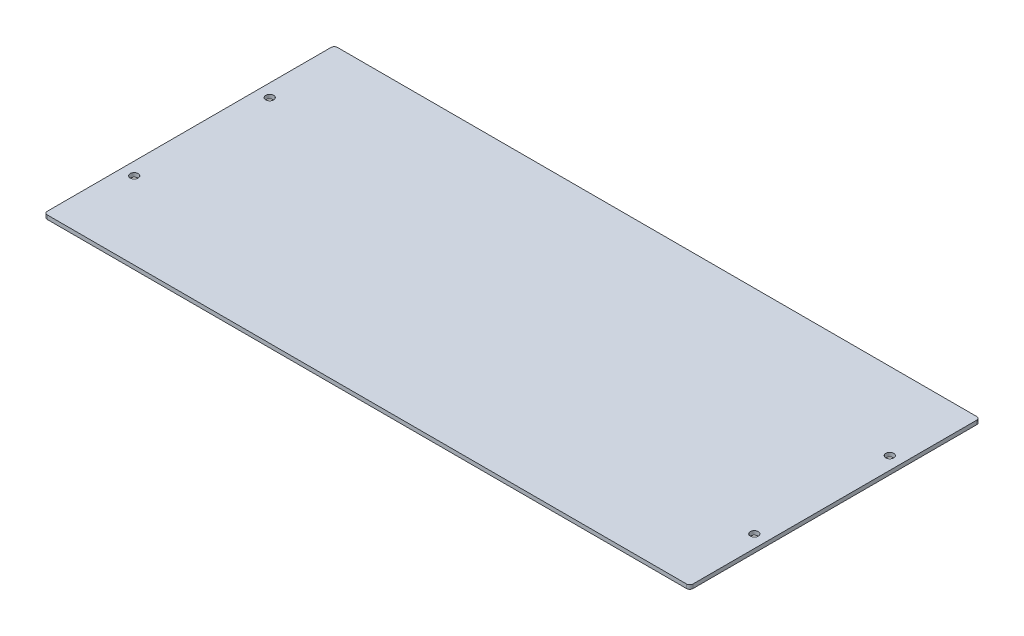
ISO-10303-21;
HEADER;
FILE_DESCRIPTION(('STEP AP214'),'2;1');
FILE_NAME('part.step','',(''),(''),'','','');
FILE_SCHEMA(('AUTOMOTIVE_DESIGN { 1 0 10303 214 1 1 1 1 }'));
ENDSEC;
DATA;
#1=APPLICATION_CONTEXT('core data for automotive mechanical design processes');
#2=APPLICATION_PROTOCOL_DEFINITION('international standard','automotive_design',2000,#1);
#3=PRODUCT_CONTEXT('',#1,'mechanical');
#4=PRODUCT('Part','Part','',(#3));
#5=PRODUCT_RELATED_PRODUCT_CATEGORY('part','',(#4));
#6=PRODUCT_DEFINITION_FORMATION('','',#4);
#7=PRODUCT_DEFINITION_CONTEXT('part definition',#1,'design');
#8=PRODUCT_DEFINITION('design','',#6,#7);
#9=PRODUCT_DEFINITION_SHAPE('','',#8);
#10=(LENGTH_UNIT() NAMED_UNIT(*) SI_UNIT(.MILLI.,.METRE.));
#11=(NAMED_UNIT(*) PLANE_ANGLE_UNIT() SI_UNIT($,.RADIAN.));
#12=(NAMED_UNIT(*) SI_UNIT($,.STERADIAN.) SOLID_ANGLE_UNIT());
#13=UNCERTAINTY_MEASURE_WITH_UNIT(LENGTH_MEASURE(1.E-05),#10,'distance_accuracy_value','');
#14=(GEOMETRIC_REPRESENTATION_CONTEXT(3) GLOBAL_UNCERTAINTY_ASSIGNED_CONTEXT((#13)) GLOBAL_UNIT_ASSIGNED_CONTEXT((#10,
#11,#12)) REPRESENTATION_CONTEXT('',''));
#15=CARTESIAN_POINT('',(0.,0.,0.));
#16=DIRECTION('',(0.,0.,1.));
#17=DIRECTION('',(1.,0.,0.));
#18=AXIS2_PLACEMENT_3D('',#15,#16,#17);
#19=CARTESIAN_POINT('',(257.175,3.175,115.57));
#20=DIRECTION('',(-1.,0.,0.));
#21=DIRECTION('',(0.,0.,1.));
#22=AXIS2_PLACEMENT_3D('',#19,#20,#21);
#23=PLANE('',#22);
#24=DIRECTION('',(0.,0.,-1.));
#25=VECTOR('',#24,1.);
#26=CARTESIAN_POINT('',(257.175,3.175,115.57));
#27=LINE('',#26,#25);
#28=CARTESIAN_POINT('',(257.175,3.175,113.03));
#29=VERTEX_POINT('',#28);
#30=CARTESIAN_POINT('',(257.175,3.175,-113.03));
#31=VERTEX_POINT('',#30);
#32=EDGE_CURVE('E120',#29,#31,#27,.T.);
#33=ORIENTED_EDGE('',*,*,#32,.F.);
#34=DIRECTION('',(0.,-1.,0.));
#35=VECTOR('',#34,1.);
#36=CARTESIAN_POINT('',(257.175,3.175,113.03));
#37=LINE('',#36,#35);
#38=CARTESIAN_POINT('',(257.175,0.,113.03));
#39=VERTEX_POINT('',#38);
#40=EDGE_CURVE('E105',#29,#39,#37,.T.);
#41=ORIENTED_EDGE('',*,*,#40,.T.);
#42=DIRECTION('',(0.,0.,-1.));
#43=VECTOR('',#42,1.);
#44=CARTESIAN_POINT('',(257.175,0.,115.57));
#45=LINE('',#44,#43);
#46=CARTESIAN_POINT('',(257.175,0.,-113.03));
#47=VERTEX_POINT('',#46);
#48=EDGE_CURVE('E117',#39,#47,#45,.T.);
#49=ORIENTED_EDGE('',*,*,#48,.T.);
#50=DIRECTION('',(0.,-1.,0.));
#51=VECTOR('',#50,1.);
#52=CARTESIAN_POINT('',(257.175,3.175,-113.03));
#53=LINE('',#52,#51);
#54=EDGE_CURVE('E122',#47,#31,#53,.F.);
#55=ORIENTED_EDGE('',*,*,#54,.T.);
#56=EDGE_LOOP('',(#33,#41,#49,#55));
#57=FACE_BOUND('',#56,.T.);
#58=ADVANCED_FACE('F35',(#57),#23,.F.);
#59=CARTESIAN_POINT('',(-257.175,3.175,-115.57));
#60=DIRECTION('',(0.,0.,1.));
#61=DIRECTION('',(1.,0.,0.));
#62=AXIS2_PLACEMENT_3D('',#59,#60,#61);
#63=PLANE('',#62);
#64=DIRECTION('',(-1.,0.,0.));
#65=VECTOR('',#64,1.);
#66=CARTESIAN_POINT('',(-257.175,0.,-115.57));
#67=LINE('',#66,#65);
#68=CARTESIAN_POINT('',(254.635,0.,-115.57));
#69=VERTEX_POINT('',#68);
#70=CARTESIAN_POINT('',(-254.635,0.,-115.57));
#71=VERTEX_POINT('',#70);
#72=EDGE_CURVE('E127',#69,#71,#67,.T.);
#73=ORIENTED_EDGE('',*,*,#72,.T.);
#74=DIRECTION('',(0.,-1.,0.));
#75=VECTOR('',#74,1.);
#76=CARTESIAN_POINT('',(-254.635,3.175,-115.57));
#77=LINE('',#76,#75);
#78=CARTESIAN_POINT('',(-254.635,3.175,-115.57));
#79=VERTEX_POINT('',#78);
#80=EDGE_CURVE('E11',#71,#79,#77,.F.);
#81=ORIENTED_EDGE('',*,*,#80,.T.);
#82=DIRECTION('',(-1.,0.,0.));
#83=VECTOR('',#82,1.);
#84=CARTESIAN_POINT('',(-257.175,3.175,-115.57));
#85=LINE('',#84,#83);
#86=CARTESIAN_POINT('',(254.635,3.175,-115.57));
#87=VERTEX_POINT('',#86);
#88=EDGE_CURVE('E166',#87,#79,#85,.T.);
#89=ORIENTED_EDGE('',*,*,#88,.F.);
#90=DIRECTION('',(0.,-1.,0.));
#91=VECTOR('',#90,1.);
#92=CARTESIAN_POINT('',(254.635,3.175,-115.57));
#93=LINE('',#92,#91);
#94=EDGE_CURVE('E43',#87,#69,#93,.T.);
#95=ORIENTED_EDGE('',*,*,#94,.T.);
#96=EDGE_LOOP('',(#73,#81,#89,#95));
#97=FACE_BOUND('',#96,.T.);
#98=ADVANCED_FACE('F164',(#97),#63,.F.);
#99=CARTESIAN_POINT('',(-257.175,3.175,115.57));
#100=DIRECTION('',(1.,0.,0.));
#101=DIRECTION('',(0.,0.,-1.));
#102=AXIS2_PLACEMENT_3D('',#99,#100,#101);
#103=PLANE('',#102);
#104=DIRECTION('',(0.,0.,1.));
#105=VECTOR('',#104,1.);
#106=CARTESIAN_POINT('',(-257.175,3.175,115.57));
#107=LINE('',#106,#105);
#108=CARTESIAN_POINT('',(-257.175,3.175,-113.03));
#109=VERTEX_POINT('',#108);
#110=CARTESIAN_POINT('',(-257.175,3.175,113.03));
#111=VERTEX_POINT('',#110);
#112=EDGE_CURVE('E174',#109,#111,#107,.T.);
#113=ORIENTED_EDGE('',*,*,#112,.F.);
#114=DIRECTION('',(0.,-1.,0.));
#115=VECTOR('',#114,1.);
#116=CARTESIAN_POINT('',(-257.175,3.175,-113.03));
#117=LINE('',#116,#115);
#118=CARTESIAN_POINT('',(-257.175,0.,-113.03));
#119=VERTEX_POINT('',#118);
#120=EDGE_CURVE('E158',#109,#119,#117,.T.);
#121=ORIENTED_EDGE('',*,*,#120,.T.);
#122=DIRECTION('',(0.,0.,1.));
#123=VECTOR('',#122,1.);
#124=CARTESIAN_POINT('',(-257.175,0.,115.57));
#125=LINE('',#124,#123);
#126=CARTESIAN_POINT('',(-257.175,0.,113.03));
#127=VERTEX_POINT('',#126);
#128=EDGE_CURVE('E131',#119,#127,#125,.T.);
#129=ORIENTED_EDGE('',*,*,#128,.T.);
#130=DIRECTION('',(0.,-1.,0.));
#131=VECTOR('',#130,1.);
#132=CARTESIAN_POINT('',(-257.175,3.175,113.03));
#133=LINE('',#132,#131);
#134=EDGE_CURVE('E50',#127,#111,#133,.F.);
#135=ORIENTED_EDGE('',*,*,#134,.T.);
#136=EDGE_LOOP('',(#113,#121,#129,#135));
#137=FACE_BOUND('',#136,.T.);
#138=ADVANCED_FACE('F173',(#137),#103,.F.);
#139=CARTESIAN_POINT('',(-257.175,3.175,115.57));
#140=DIRECTION('',(0.,0.,-1.));
#141=DIRECTION('',(-1.,0.,0.));
#142=AXIS2_PLACEMENT_3D('',#139,#140,#141);
#143=PLANE('',#142);
#144=DIRECTION('',(1.,0.,0.));
#145=VECTOR('',#144,1.);
#146=CARTESIAN_POINT('',(-257.175,0.,115.57));
#147=LINE('',#146,#145);
#148=CARTESIAN_POINT('',(-254.635,0.,115.57));
#149=VERTEX_POINT('',#148);
#150=CARTESIAN_POINT('',(254.635,0.,115.57));
#151=VERTEX_POINT('',#150);
#152=EDGE_CURVE('E141',#149,#151,#147,.T.);
#153=ORIENTED_EDGE('',*,*,#152,.T.);
#154=DIRECTION('',(0.,-1.,0.));
#155=VECTOR('',#154,1.);
#156=CARTESIAN_POINT('',(254.635,3.175,115.57));
#157=LINE('',#156,#155);
#158=CARTESIAN_POINT('',(254.635,3.175,115.57));
#159=VERTEX_POINT('',#158);
#160=EDGE_CURVE('E106',#151,#159,#157,.F.);
#161=ORIENTED_EDGE('',*,*,#160,.T.);
#162=DIRECTION('',(1.,0.,0.));
#163=VECTOR('',#162,1.);
#164=CARTESIAN_POINT('',(-257.175,3.175,115.57));
#165=LINE('',#164,#163);
#166=CARTESIAN_POINT('',(-254.635,3.175,115.57));
#167=VERTEX_POINT('',#166);
#168=EDGE_CURVE('E137',#167,#159,#165,.T.);
#169=ORIENTED_EDGE('',*,*,#168,.F.);
#170=DIRECTION('',(0.,-1.,0.));
#171=VECTOR('',#170,1.);
#172=CARTESIAN_POINT('',(-254.635,3.175,115.57));
#173=LINE('',#172,#171);
#174=EDGE_CURVE('E111',#167,#149,#173,.T.);
#175=ORIENTED_EDGE('',*,*,#174,.T.);
#176=EDGE_LOOP('',(#153,#161,#169,#175));
#177=FACE_BOUND('',#176,.T.);
#178=ADVANCED_FACE('F206',(#177),#143,.F.);
#179=CARTESIAN_POINT('',(0.,3.175,0.));
#180=DIRECTION('',(0.,-1.,0.));
#181=DIRECTION('',(0.,0.,-1.));
#182=AXIS2_PLACEMENT_3D('',#179,#180,#181);
#183=PLANE('',#182);
#184=CARTESIAN_POINT('',(-247.015,3.175,-53.975));
#185=DIRECTION('',(0.,1.,0.));
#186=DIRECTION('',(0.,0.,1.));
#187=AXIS2_PLACEMENT_3D('',#184,#185,#186);
#188=CIRCLE('',#187,3.17499999999998);
#189=CARTESIAN_POINT('',(-247.015,3.175,-50.8));
#190=VERTEX_POINT('',#189);
#191=EDGE_CURVE('E197',#190,#190,#188,.T.);
#192=ORIENTED_EDGE('',*,*,#191,.F.);
#193=EDGE_LOOP('',(#192));
#194=FACE_BOUND('',#193,.T.);
#195=CARTESIAN_POINT('',(-247.015,3.175,53.975));
#196=DIRECTION('',(0.,1.,0.));
#197=DIRECTION('',(0.,0.,1.));
#198=AXIS2_PLACEMENT_3D('',#195,#196,#197);
#199=CIRCLE('',#198,3.17499999999998);
#200=CARTESIAN_POINT('',(-247.015,3.175,57.15));
#201=VERTEX_POINT('',#200);
#202=EDGE_CURVE('E191',#201,#201,#199,.T.);
#203=ORIENTED_EDGE('',*,*,#202,.F.);
#204=EDGE_LOOP('',(#203));
#205=FACE_BOUND('',#204,.T.);
#206=CARTESIAN_POINT('',(247.015,3.175,53.9749999999999));
#207=DIRECTION('',(0.,1.,0.));
#208=DIRECTION('',(0.,0.,1.));
#209=AXIS2_PLACEMENT_3D('',#206,#207,#208);
#210=CIRCLE('',#209,3.17499999999998);
#211=CARTESIAN_POINT('',(247.015,3.175,57.1499999999999));
#212=VERTEX_POINT('',#211);
#213=EDGE_CURVE('E185',#212,#212,#210,.T.);
#214=ORIENTED_EDGE('',*,*,#213,.F.);
#215=EDGE_LOOP('',(#214));
#216=FACE_BOUND('',#215,.T.);
#217=CARTESIAN_POINT('',(247.015,3.175,-53.9750000000001));
#218=DIRECTION('',(0.,1.,0.));
#219=DIRECTION('',(0.,0.,1.));
#220=AXIS2_PLACEMENT_3D('',#217,#218,#219);
#221=CIRCLE('',#220,3.17499999999998);
#222=CARTESIAN_POINT('',(247.015,3.175,-50.8000000000001));
#223=VERTEX_POINT('',#222);
#224=EDGE_CURVE('E134',#223,#223,#221,.T.);
#225=ORIENTED_EDGE('',*,*,#224,.F.);
#226=EDGE_LOOP('',(#225));
#227=FACE_BOUND('',#226,.T.);
#228=ORIENTED_EDGE('',*,*,#168,.T.);
#229=CARTESIAN_POINT('',(254.635,3.175,113.03));
#230=DIRECTION('',(0.,-1.,0.));
#231=DIRECTION('',(0.,0.,-1.));
#232=AXIS2_PLACEMENT_3D('',#229,#230,#231);
#233=CIRCLE('',#232,2.54);
#234=EDGE_CURVE('E155',#159,#29,#233,.F.);
#235=ORIENTED_EDGE('',*,*,#234,.T.);
#236=ORIENTED_EDGE('',*,*,#32,.T.);
#237=CARTESIAN_POINT('',(254.635,3.175,-113.03));
#238=DIRECTION('',(0.,-1.,0.));
#239=DIRECTION('',(0.,0.,-1.));
#240=AXIS2_PLACEMENT_3D('',#237,#238,#239);
#241=CIRCLE('',#240,2.54);
#242=EDGE_CURVE('E152',#31,#87,#241,.F.);
#243=ORIENTED_EDGE('',*,*,#242,.T.);
#244=ORIENTED_EDGE('',*,*,#88,.T.);
#245=CARTESIAN_POINT('',(-254.635,3.175,-113.03));
#246=DIRECTION('',(0.,-1.,0.));
#247=DIRECTION('',(0.,0.,-1.));
#248=AXIS2_PLACEMENT_3D('',#245,#246,#247);
#249=CIRCLE('',#248,2.54);
#250=EDGE_CURVE('E57',#79,#109,#249,.F.);
#251=ORIENTED_EDGE('',*,*,#250,.T.);
#252=ORIENTED_EDGE('',*,*,#112,.T.);
#253=CARTESIAN_POINT('',(-254.635,3.175,113.03));
#254=DIRECTION('',(0.,-1.,0.));
#255=DIRECTION('',(0.,0.,-1.));
#256=AXIS2_PLACEMENT_3D('',#253,#254,#255);
#257=CIRCLE('',#256,2.54);
#258=EDGE_CURVE('E150',#111,#167,#257,.F.);
#259=ORIENTED_EDGE('',*,*,#258,.T.);
#260=EDGE_LOOP('',(#228,#235,#236,#243,#244,#251,#252,#259));
#261=FACE_BOUND('',#260,.T.);
#262=ADVANCED_FACE('F203',(#194,#205,#216,#227,#261),#183,.F.);
#263=CARTESIAN_POINT('',(0.,0.,0.));
#264=DIRECTION('',(0.,-1.,0.));
#265=DIRECTION('',(0.,0.,-1.));
#266=AXIS2_PLACEMENT_3D('',#263,#264,#265);
#267=PLANE('',#266);
#268=CARTESIAN_POINT('',(-247.015,0.,-53.975));
#269=DIRECTION('',(0.,1.,0.));
#270=DIRECTION('',(0.,0.,1.));
#271=AXIS2_PLACEMENT_3D('',#268,#269,#270);
#272=CIRCLE('',#271,3.17500000000001);
#273=CARTESIAN_POINT('',(-247.015,0.,-50.8));
#274=VERTEX_POINT('',#273);
#275=EDGE_CURVE('E194',#274,#274,#272,.T.);
#276=ORIENTED_EDGE('',*,*,#275,.T.);
#277=EDGE_LOOP('',(#276));
#278=FACE_BOUND('',#277,.T.);
#279=CARTESIAN_POINT('',(-247.015,0.,53.975));
#280=DIRECTION('',(0.,1.,0.));
#281=DIRECTION('',(0.,0.,1.));
#282=AXIS2_PLACEMENT_3D('',#279,#280,#281);
#283=CIRCLE('',#282,3.17500000000001);
#284=CARTESIAN_POINT('',(-247.015,0.,57.15));
#285=VERTEX_POINT('',#284);
#286=EDGE_CURVE('E188',#285,#285,#283,.T.);
#287=ORIENTED_EDGE('',*,*,#286,.T.);
#288=EDGE_LOOP('',(#287));
#289=FACE_BOUND('',#288,.T.);
#290=CARTESIAN_POINT('',(247.015,0.,53.9749999999999));
#291=DIRECTION('',(0.,1.,0.));
#292=DIRECTION('',(0.,0.,1.));
#293=AXIS2_PLACEMENT_3D('',#290,#291,#292);
#294=CIRCLE('',#293,3.17499999999998);
#295=CARTESIAN_POINT('',(247.015,0.,57.1499999999999));
#296=VERTEX_POINT('',#295);
#297=EDGE_CURVE('E182',#296,#296,#294,.T.);
#298=ORIENTED_EDGE('',*,*,#297,.T.);
#299=EDGE_LOOP('',(#298));
#300=FACE_BOUND('',#299,.T.);
#301=CARTESIAN_POINT('',(247.015,0.,-53.9750000000001));
#302=DIRECTION('',(0.,1.,0.));
#303=DIRECTION('',(0.,0.,1.));
#304=AXIS2_PLACEMENT_3D('',#301,#302,#303);
#305=CIRCLE('',#304,3.17499999999998);
#306=CARTESIAN_POINT('',(247.015,0.,-50.8000000000001));
#307=VERTEX_POINT('',#306);
#308=EDGE_CURVE('E128',#307,#307,#305,.T.);
#309=ORIENTED_EDGE('',*,*,#308,.T.);
#310=EDGE_LOOP('',(#309));
#311=FACE_BOUND('',#310,.T.);
#312=ORIENTED_EDGE('',*,*,#48,.F.);
#313=CARTESIAN_POINT('',(254.635,0.,113.03));
#314=DIRECTION('',(0.,-1.,0.));
#315=DIRECTION('',(0.,0.,-1.));
#316=AXIS2_PLACEMENT_3D('',#313,#314,#315);
#317=CIRCLE('',#316,2.54);
#318=EDGE_CURVE('E101',#39,#151,#317,.T.);
#319=ORIENTED_EDGE('',*,*,#318,.T.);
#320=ORIENTED_EDGE('',*,*,#152,.F.);
#321=CARTESIAN_POINT('',(-254.635,0.,113.03));
#322=DIRECTION('',(0.,-1.,0.));
#323=DIRECTION('',(0.,0.,-1.));
#324=AXIS2_PLACEMENT_3D('',#321,#322,#323);
#325=CIRCLE('',#324,2.54);
#326=EDGE_CURVE('E121',#149,#127,#325,.T.);
#327=ORIENTED_EDGE('',*,*,#326,.T.);
#328=ORIENTED_EDGE('',*,*,#128,.F.);
#329=CARTESIAN_POINT('',(-254.635,0.,-113.03));
#330=DIRECTION('',(0.,-1.,0.));
#331=DIRECTION('',(0.,0.,-1.));
#332=AXIS2_PLACEMENT_3D('',#329,#330,#331);
#333=CIRCLE('',#332,2.54);
#334=EDGE_CURVE('E112',#119,#71,#333,.T.);
#335=ORIENTED_EDGE('',*,*,#334,.T.);
#336=ORIENTED_EDGE('',*,*,#72,.F.);
#337=CARTESIAN_POINT('',(254.635,0.,-113.03));
#338=DIRECTION('',(0.,-1.,0.));
#339=DIRECTION('',(0.,0.,-1.));
#340=AXIS2_PLACEMENT_3D('',#337,#338,#339);
#341=CIRCLE('',#340,2.54);
#342=EDGE_CURVE('E126',#69,#47,#341,.T.);
#343=ORIENTED_EDGE('',*,*,#342,.T.);
#344=EDGE_LOOP('',(#312,#319,#320,#327,#328,#335,#336,#343));
#345=FACE_BOUND('',#344,.T.);
#346=ADVANCED_FACE('F124',(#278,#289,#300,#311,#345),#267,.T.);
#347=CARTESIAN_POINT('',(247.015,3.175,-53.9750000000001));
#348=DIRECTION('',(0.,1.,0.));
#349=DIRECTION('',(0.,0.,1.));
#350=AXIS2_PLACEMENT_3D('',#347,#348,#349);
#351=CYLINDRICAL_SURFACE('',#350,3.17499999999998);
#352=ORIENTED_EDGE('',*,*,#308,.F.);
#353=EDGE_LOOP('',(#352));
#354=FACE_BOUND('',#353,.T.);
#355=ORIENTED_EDGE('',*,*,#224,.T.);
#356=EDGE_LOOP('',(#355));
#357=FACE_BOUND('',#356,.T.);
#358=ADVANCED_FACE('F280',(#354,#357),#351,.F.);
#359=CARTESIAN_POINT('',(247.015,3.175,53.9749999999999));
#360=DIRECTION('',(0.,1.,0.));
#361=DIRECTION('',(0.,0.,1.));
#362=AXIS2_PLACEMENT_3D('',#359,#360,#361);
#363=CYLINDRICAL_SURFACE('',#362,3.17499999999998);
#364=ORIENTED_EDGE('',*,*,#297,.F.);
#365=EDGE_LOOP('',(#364));
#366=FACE_BOUND('',#365,.T.);
#367=ORIENTED_EDGE('',*,*,#213,.T.);
#368=EDGE_LOOP('',(#367));
#369=FACE_BOUND('',#368,.T.);
#370=ADVANCED_FACE('F271',(#366,#369),#363,.F.);
#371=CARTESIAN_POINT('',(-247.015,3.175,53.975));
#372=DIRECTION('',(0.,1.,0.));
#373=DIRECTION('',(0.,0.,1.));
#374=AXIS2_PLACEMENT_3D('',#371,#372,#373);
#375=CYLINDRICAL_SURFACE('',#374,3.175);
#376=ORIENTED_EDGE('',*,*,#286,.F.);
#377=EDGE_LOOP('',(#376));
#378=FACE_BOUND('',#377,.T.);
#379=ORIENTED_EDGE('',*,*,#202,.T.);
#380=EDGE_LOOP('',(#379));
#381=FACE_BOUND('',#380,.T.);
#382=ADVANCED_FACE('F262',(#378,#381),#375,.F.);
#383=CARTESIAN_POINT('',(-247.015,3.175,-53.975));
#384=DIRECTION('',(0.,1.,0.));
#385=DIRECTION('',(0.,0.,1.));
#386=AXIS2_PLACEMENT_3D('',#383,#384,#385);
#387=CYLINDRICAL_SURFACE('',#386,3.175);
#388=ORIENTED_EDGE('',*,*,#275,.F.);
#389=EDGE_LOOP('',(#388));
#390=FACE_BOUND('',#389,.T.);
#391=ORIENTED_EDGE('',*,*,#191,.T.);
#392=EDGE_LOOP('',(#391));
#393=FACE_BOUND('',#392,.T.);
#394=ADVANCED_FACE('F201',(#390,#393),#387,.F.);
#395=CARTESIAN_POINT('',(254.635,3.175,113.03));
#396=DIRECTION('',(0.,-1.,0.));
#397=DIRECTION('',(0.,0.,-1.));
#398=AXIS2_PLACEMENT_3D('',#395,#396,#397);
#399=CYLINDRICAL_SURFACE('',#398,2.54);
#400=ORIENTED_EDGE('',*,*,#234,.F.);
#401=ORIENTED_EDGE('',*,*,#160,.F.);
#402=ORIENTED_EDGE('',*,*,#318,.F.);
#403=ORIENTED_EDGE('',*,*,#40,.F.);
#404=EDGE_LOOP('',(#400,#401,#402,#403));
#405=FACE_BOUND('',#404,.T.);
#406=ADVANCED_FACE('F104',(#405),#399,.T.);
#407=CARTESIAN_POINT('',(-254.635,3.175,-113.03));
#408=DIRECTION('',(0.,-1.,0.));
#409=DIRECTION('',(0.,0.,-1.));
#410=AXIS2_PLACEMENT_3D('',#407,#408,#409);
#411=CYLINDRICAL_SURFACE('',#410,2.54);
#412=ORIENTED_EDGE('',*,*,#250,.F.);
#413=ORIENTED_EDGE('',*,*,#80,.F.);
#414=ORIENTED_EDGE('',*,*,#334,.F.);
#415=ORIENTED_EDGE('',*,*,#120,.F.);
#416=EDGE_LOOP('',(#412,#413,#414,#415));
#417=FACE_BOUND('',#416,.T.);
#418=ADVANCED_FACE('F172',(#417),#411,.T.);
#419=CARTESIAN_POINT('',(254.635,3.175,-113.03));
#420=DIRECTION('',(0.,-1.,0.));
#421=DIRECTION('',(0.,0.,-1.));
#422=AXIS2_PLACEMENT_3D('',#419,#420,#421);
#423=CYLINDRICAL_SURFACE('',#422,2.54);
#424=ORIENTED_EDGE('',*,*,#242,.F.);
#425=ORIENTED_EDGE('',*,*,#54,.F.);
#426=ORIENTED_EDGE('',*,*,#342,.F.);
#427=ORIENTED_EDGE('',*,*,#94,.F.);
#428=EDGE_LOOP('',(#424,#425,#426,#427));
#429=FACE_BOUND('',#428,.T.);
#430=ADVANCED_FACE('F218',(#429),#423,.T.);
#431=CARTESIAN_POINT('',(-254.635,3.175,113.03));
#432=DIRECTION('',(0.,-1.,0.));
#433=DIRECTION('',(0.,0.,-1.));
#434=AXIS2_PLACEMENT_3D('',#431,#432,#433);
#435=CYLINDRICAL_SURFACE('',#434,2.54);
#436=ORIENTED_EDGE('',*,*,#258,.F.);
#437=ORIENTED_EDGE('',*,*,#134,.F.);
#438=ORIENTED_EDGE('',*,*,#326,.F.);
#439=ORIENTED_EDGE('',*,*,#174,.F.);
#440=EDGE_LOOP('',(#436,#437,#438,#439));
#441=FACE_BOUND('',#440,.T.);
#442=ADVANCED_FACE('F37',(#441),#435,.T.);
#443=CLOSED_SHELL('',(#58,#98,#138,#178,#262,#346,#358,#370,#382,#394,#406,#418,#430,#442));
#444=MANIFOLD_SOLID_BREP('B2',#443);
#445=ADVANCED_BREP_SHAPE_REPRESENTATION('',(#18,#444),#14);
#446=SHAPE_DEFINITION_REPRESENTATION(#9,#445);
ENDSEC;
END-ISO-10303-21;
